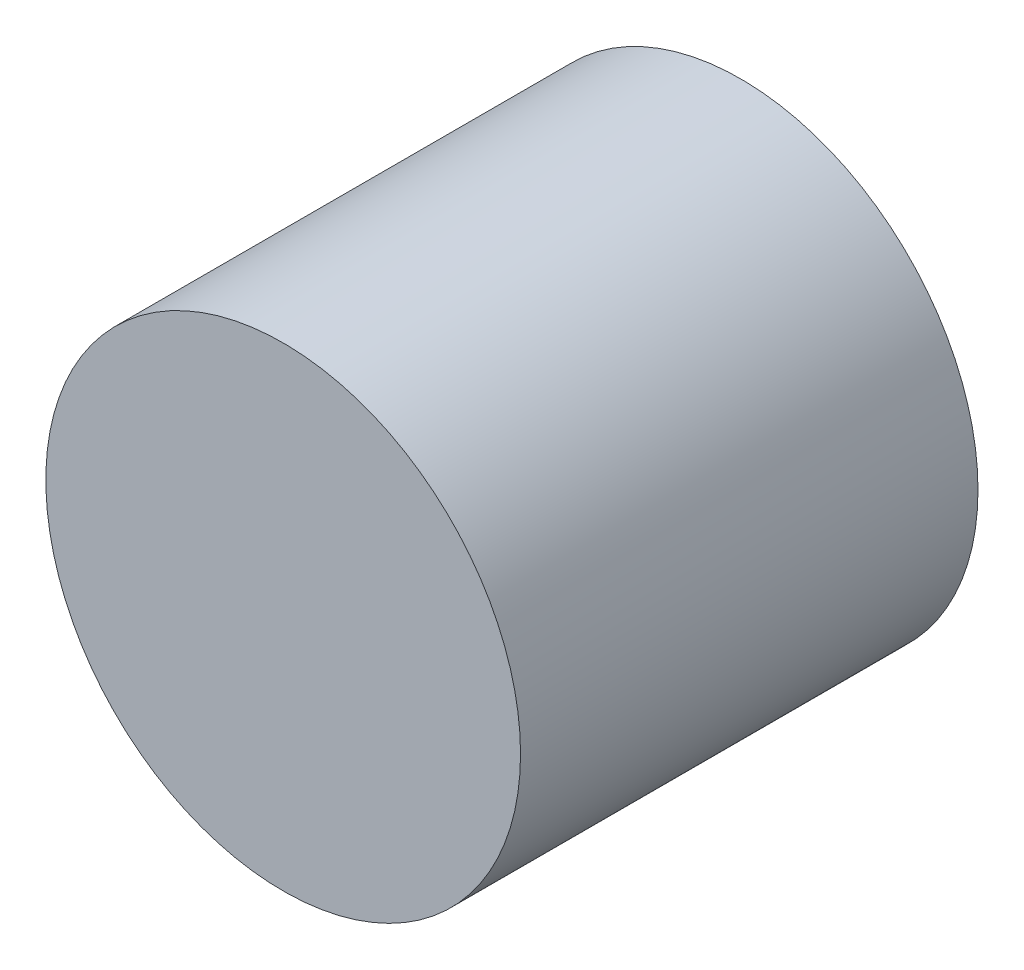
ISO-10303-21;
HEADER;
FILE_DESCRIPTION(('STEP AP214'),'2;1');
FILE_NAME('part.step','',(''),(''),'','','');
FILE_SCHEMA(('AUTOMOTIVE_DESIGN { 1 0 10303 214 1 1 1 1 }'));
ENDSEC;
DATA;
#1=APPLICATION_CONTEXT('core data for automotive mechanical design processes');
#2=APPLICATION_PROTOCOL_DEFINITION('international standard','automotive_design',2000,#1);
#3=PRODUCT_CONTEXT('',#1,'mechanical');
#4=PRODUCT('Part','Part','',(#3));
#5=PRODUCT_RELATED_PRODUCT_CATEGORY('part','',(#4));
#6=PRODUCT_DEFINITION_FORMATION('','',#4);
#7=PRODUCT_DEFINITION_CONTEXT('part definition',#1,'design');
#8=PRODUCT_DEFINITION('design','',#6,#7);
#9=PRODUCT_DEFINITION_SHAPE('','',#8);
#10=(LENGTH_UNIT() NAMED_UNIT(*) SI_UNIT(.MILLI.,.METRE.));
#11=(NAMED_UNIT(*) PLANE_ANGLE_UNIT() SI_UNIT($,.RADIAN.));
#12=(NAMED_UNIT(*) SI_UNIT($,.STERADIAN.) SOLID_ANGLE_UNIT());
#13=UNCERTAINTY_MEASURE_WITH_UNIT(LENGTH_MEASURE(1.E-05),#10,'distance_accuracy_value','');
#14=(GEOMETRIC_REPRESENTATION_CONTEXT(3) GLOBAL_UNCERTAINTY_ASSIGNED_CONTEXT((#13)) GLOBAL_UNIT_ASSIGNED_CONTEXT((#10,
#11,#12)) REPRESENTATION_CONTEXT('',''));
#15=CARTESIAN_POINT('',(0.,0.,0.));
#16=DIRECTION('',(0.,0.,1.));
#17=DIRECTION('',(1.,0.,0.));
#18=AXIS2_PLACEMENT_3D('',#15,#16,#17);
#19=CARTESIAN_POINT('',(0.,0.,-26.5));
#20=DIRECTION('',(0.,0.,1.));
#21=DIRECTION('',(1.,0.,0.));
#22=AXIS2_PLACEMENT_3D('',#19,#20,#21);
#23=CYLINDRICAL_SURFACE('',#22,13.75);
#24=CARTESIAN_POINT('',(0.,0.,-26.5));
#25=DIRECTION('',(0.,0.,1.));
#26=DIRECTION('',(1.,0.,0.));
#27=AXIS2_PLACEMENT_3D('',#24,#25,#26);
#28=CIRCLE('',#27,13.75);
#29=CARTESIAN_POINT('',(13.75,0.,-26.5));
#30=VERTEX_POINT('',#29);
#31=EDGE_CURVE('E10',#30,#30,#28,.T.);
#32=ORIENTED_EDGE('',*,*,#31,.T.);
#33=EDGE_LOOP('',(#32));
#34=FACE_BOUND('',#33,.T.);
#35=CARTESIAN_POINT('',(0.,0.,0.));
#36=DIRECTION('',(0.,0.,1.));
#37=DIRECTION('',(1.,0.,0.));
#38=AXIS2_PLACEMENT_3D('',#35,#36,#37);
#39=CIRCLE('',#38,13.75);
#40=CARTESIAN_POINT('',(13.75,0.,0.));
#41=VERTEX_POINT('',#40);
#42=EDGE_CURVE('E40',#41,#41,#39,.T.);
#43=ORIENTED_EDGE('',*,*,#42,.F.);
#44=EDGE_LOOP('',(#43));
#45=FACE_BOUND('',#44,.T.);
#46=ADVANCED_FACE('F37',(#34,#45),#23,.T.);
#47=CARTESIAN_POINT('',(0.,0.,-26.5));
#48=DIRECTION('',(0.,0.,1.));
#49=DIRECTION('',(1.,0.,0.));
#50=AXIS2_PLACEMENT_3D('',#47,#48,#49);
#51=PLANE('',#50);
#52=ORIENTED_EDGE('',*,*,#31,.F.);
#53=EDGE_LOOP('',(#52));
#54=FACE_BOUND('',#53,.T.);
#55=ADVANCED_FACE('F52',(#54),#51,.F.);
#56=CARTESIAN_POINT('',(0.,0.,0.));
#57=DIRECTION('',(0.,0.,1.));
#58=DIRECTION('',(1.,0.,0.));
#59=AXIS2_PLACEMENT_3D('',#56,#57,#58);
#60=PLANE('',#59);
#61=ORIENTED_EDGE('',*,*,#42,.T.);
#62=EDGE_LOOP('',(#61));
#63=FACE_BOUND('',#62,.T.);
#64=ADVANCED_FACE('F49',(#63),#60,.T.);
#65=CLOSED_SHELL('',(#46,#55,#64));
#66=MANIFOLD_SOLID_BREP('B2',#65);
#67=ADVANCED_BREP_SHAPE_REPRESENTATION('',(#18,#66),#14);
#68=SHAPE_DEFINITION_REPRESENTATION(#9,#67);
ENDSEC;
END-ISO-10303-21;
